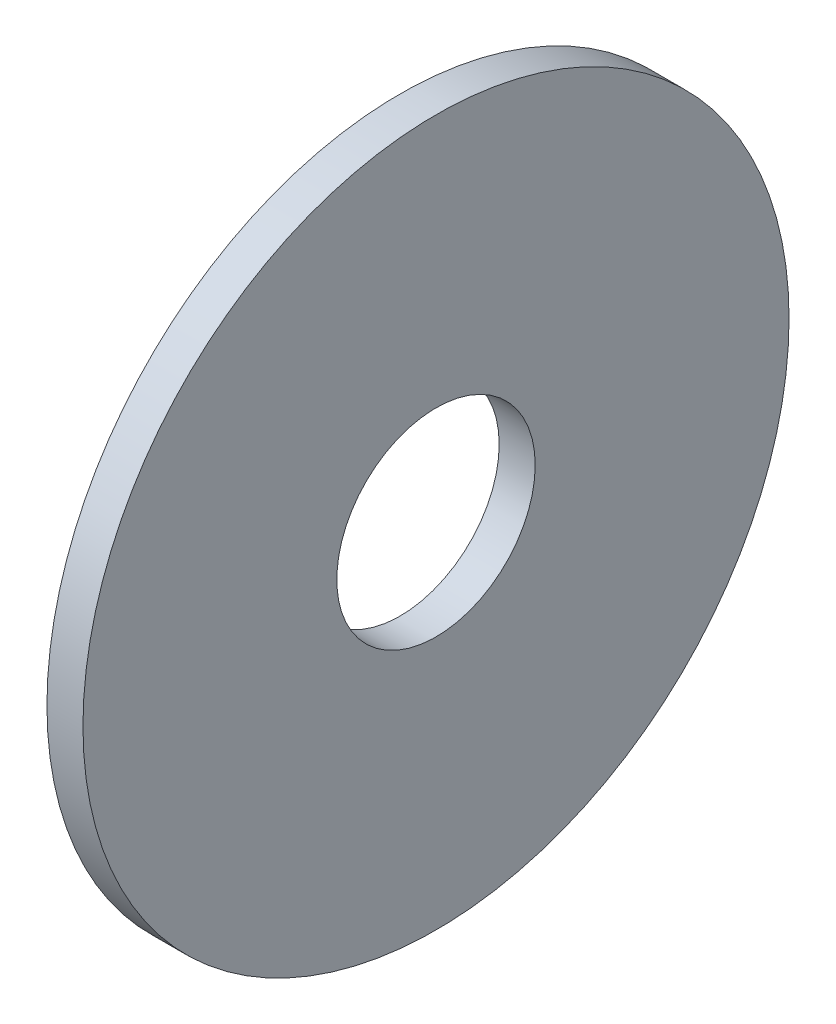
ISO-10303-21;
HEADER;
FILE_DESCRIPTION(('STEP AP214'),'2;1');
FILE_NAME('part.step','',(''),(''),'','','');
FILE_SCHEMA(('AUTOMOTIVE_DESIGN { 1 0 10303 214 1 1 1 1 }'));
ENDSEC;
DATA;
#1=APPLICATION_CONTEXT('core data for automotive mechanical design processes');
#2=APPLICATION_PROTOCOL_DEFINITION('international standard','automotive_design',2000,#1);
#3=PRODUCT_CONTEXT('',#1,'mechanical');
#4=PRODUCT('Part','Part','',(#3));
#5=PRODUCT_RELATED_PRODUCT_CATEGORY('part','',(#4));
#6=PRODUCT_DEFINITION_FORMATION('','',#4);
#7=PRODUCT_DEFINITION_CONTEXT('part definition',#1,'design');
#8=PRODUCT_DEFINITION('design','',#6,#7);
#9=PRODUCT_DEFINITION_SHAPE('','',#8);
#10=(LENGTH_UNIT() NAMED_UNIT(*) SI_UNIT(.MILLI.,.METRE.));
#11=(NAMED_UNIT(*) PLANE_ANGLE_UNIT() SI_UNIT($,.RADIAN.));
#12=(NAMED_UNIT(*) SI_UNIT($,.STERADIAN.) SOLID_ANGLE_UNIT());
#13=UNCERTAINTY_MEASURE_WITH_UNIT(LENGTH_MEASURE(1.E-05),#10,'distance_accuracy_value','');
#14=(GEOMETRIC_REPRESENTATION_CONTEXT(3) GLOBAL_UNCERTAINTY_ASSIGNED_CONTEXT((#13)) GLOBAL_UNIT_ASSIGNED_CONTEXT((#10,
#11,#12)) REPRESENTATION_CONTEXT('',''));
#15=CARTESIAN_POINT('',(0.,0.,0.));
#16=DIRECTION('',(0.,0.,1.));
#17=DIRECTION('',(1.,0.,0.));
#18=AXIS2_PLACEMENT_3D('',#15,#16,#17);
#19=CARTESIAN_POINT('',(1.2954,0.,0.));
#20=DIRECTION('',(1.,0.,0.));
#21=DIRECTION('',(0.,0.,-1.));
#22=AXIS2_PLACEMENT_3D('',#19,#20,#21);
#23=PLANE('',#22);
#24=CARTESIAN_POINT('',(1.2954,0.,0.));
#25=DIRECTION('',(1.,0.,0.));
#26=DIRECTION('',(0.,0.,-1.));
#27=AXIS2_PLACEMENT_3D('',#24,#25,#26);
#28=CIRCLE('',#27,12.7);
#29=CARTESIAN_POINT('',(1.2954,0.,-12.7));
#30=VERTEX_POINT('',#29);
#31=EDGE_CURVE('E10',#30,#30,#28,.T.);
#32=ORIENTED_EDGE('',*,*,#31,.T.);
#33=EDGE_LOOP('',(#32));
#34=FACE_BOUND('',#33,.T.);
#35=CARTESIAN_POINT('',(1.2954,0.,0.));
#36=DIRECTION('',(1.,0.,0.));
#37=DIRECTION('',(0.,0.,-1.));
#38=AXIS2_PLACEMENT_3D('',#35,#36,#37);
#39=CIRCLE('',#38,3.5687);
#40=CARTESIAN_POINT('',(1.2954,0.,-3.5687));
#41=VERTEX_POINT('',#40);
#42=EDGE_CURVE('E41',#41,#41,#39,.T.);
#43=ORIENTED_EDGE('',*,*,#42,.F.);
#44=EDGE_LOOP('',(#43));
#45=FACE_BOUND('',#44,.T.);
#46=ADVANCED_FACE('F30',(#34,#45),#23,.T.);
#47=CARTESIAN_POINT('',(0.,0.,0.));
#48=DIRECTION('',(1.,0.,0.));
#49=DIRECTION('',(0.,0.,-1.));
#50=AXIS2_PLACEMENT_3D('',#47,#48,#49);
#51=PLANE('',#50);
#52=CARTESIAN_POINT('',(0.,0.,0.));
#53=DIRECTION('',(1.,0.,0.));
#54=DIRECTION('',(0.,0.,-1.));
#55=AXIS2_PLACEMENT_3D('',#52,#53,#54);
#56=CIRCLE('',#55,12.7);
#57=CARTESIAN_POINT('',(0.,0.,-12.7));
#58=VERTEX_POINT('',#57);
#59=EDGE_CURVE('E34',#58,#58,#56,.T.);
#60=ORIENTED_EDGE('',*,*,#59,.F.);
#61=EDGE_LOOP('',(#60));
#62=FACE_BOUND('',#61,.T.);
#63=CARTESIAN_POINT('',(0.,0.,0.));
#64=DIRECTION('',(1.,0.,0.));
#65=DIRECTION('',(0.,0.,-1.));
#66=AXIS2_PLACEMENT_3D('',#63,#64,#65);
#67=CIRCLE('',#66,3.5687);
#68=CARTESIAN_POINT('',(0.,0.,-3.5687));
#69=VERTEX_POINT('',#68);
#70=EDGE_CURVE('E43',#69,#69,#67,.T.);
#71=ORIENTED_EDGE('',*,*,#70,.T.);
#72=EDGE_LOOP('',(#71));
#73=FACE_BOUND('',#72,.T.);
#74=ADVANCED_FACE('F53',(#62,#73),#51,.F.);
#75=CARTESIAN_POINT('',(1.2954,0.,0.));
#76=DIRECTION('',(-1.,0.,0.));
#77=DIRECTION('',(0.,0.,1.));
#78=AXIS2_PLACEMENT_3D('',#75,#76,#77);
#79=CYLINDRICAL_SURFACE('',#78,12.7);
#80=ORIENTED_EDGE('',*,*,#31,.F.);
#81=EDGE_LOOP('',(#80));
#82=FACE_BOUND('',#81,.T.);
#83=ORIENTED_EDGE('',*,*,#59,.T.);
#84=EDGE_LOOP('',(#83));
#85=FACE_BOUND('',#84,.T.);
#86=ADVANCED_FACE('F32',(#82,#85),#79,.T.);
#87=CARTESIAN_POINT('',(1.2954,0.,0.));
#88=DIRECTION('',(-1.,0.,0.));
#89=DIRECTION('',(0.,0.,1.));
#90=AXIS2_PLACEMENT_3D('',#87,#88,#89);
#91=CYLINDRICAL_SURFACE('',#90,3.5687);
#92=ORIENTED_EDGE('',*,*,#42,.T.);
#93=EDGE_LOOP('',(#92));
#94=FACE_BOUND('',#93,.T.);
#95=ORIENTED_EDGE('',*,*,#70,.F.);
#96=EDGE_LOOP('',(#95));
#97=FACE_BOUND('',#96,.T.);
#98=ADVANCED_FACE('F49',(#94,#97),#91,.F.);
#99=CLOSED_SHELL('',(#46,#74,#86,#98));
#100=MANIFOLD_SOLID_BREP('B2',#99);
#101=ADVANCED_BREP_SHAPE_REPRESENTATION('',(#18,#100),#14);
#102=SHAPE_DEFINITION_REPRESENTATION(#9,#101);
ENDSEC;
END-ISO-10303-21;
